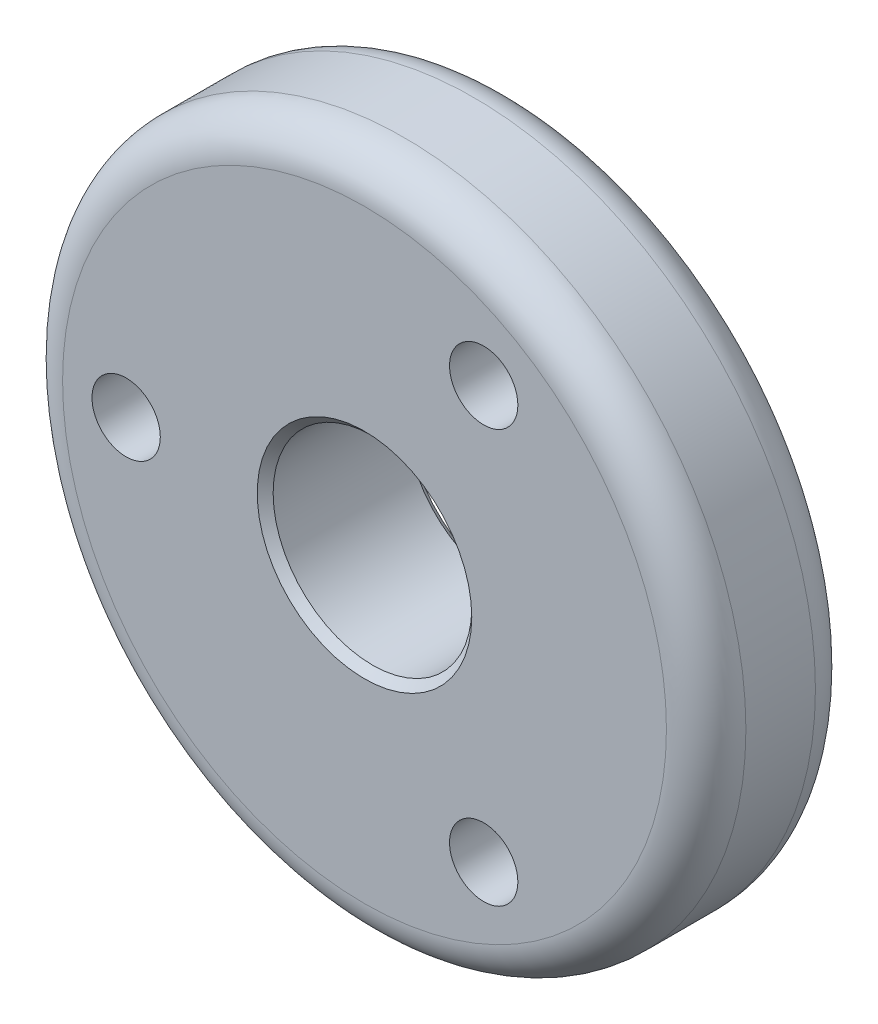
ISO-10303-21;
HEADER;
FILE_DESCRIPTION(('STEP AP214'),'2;1');
FILE_NAME('part.step','',(''),(''),'','','');
FILE_SCHEMA(('AUTOMOTIVE_DESIGN { 1 0 10303 214 1 1 1 1 }'));
ENDSEC;
DATA;
#1=APPLICATION_CONTEXT('core data for automotive mechanical design processes');
#2=APPLICATION_PROTOCOL_DEFINITION('international standard','automotive_design',2000,#1);
#3=PRODUCT_CONTEXT('',#1,'mechanical');
#4=PRODUCT('Part','Part','',(#3));
#5=PRODUCT_RELATED_PRODUCT_CATEGORY('part','',(#4));
#6=PRODUCT_DEFINITION_FORMATION('','',#4);
#7=PRODUCT_DEFINITION_CONTEXT('part definition',#1,'design');
#8=PRODUCT_DEFINITION('design','',#6,#7);
#9=PRODUCT_DEFINITION_SHAPE('','',#8);
#10=(LENGTH_UNIT() NAMED_UNIT(*) SI_UNIT(.MILLI.,.METRE.));
#11=(NAMED_UNIT(*) PLANE_ANGLE_UNIT() SI_UNIT($,.RADIAN.));
#12=(NAMED_UNIT(*) SI_UNIT($,.STERADIAN.) SOLID_ANGLE_UNIT());
#13=UNCERTAINTY_MEASURE_WITH_UNIT(LENGTH_MEASURE(1.E-05),#10,'distance_accuracy_value','');
#14=(GEOMETRIC_REPRESENTATION_CONTEXT(3) GLOBAL_UNCERTAINTY_ASSIGNED_CONTEXT((#13)) GLOBAL_UNIT_ASSIGNED_CONTEXT((#10,
#11,#12)) REPRESENTATION_CONTEXT('',''));
#15=CARTESIAN_POINT('',(0.,0.,0.));
#16=DIRECTION('',(0.,0.,1.));
#17=DIRECTION('',(1.,0.,0.));
#18=AXIS2_PLACEMENT_3D('',#15,#16,#17);
#19=CARTESIAN_POINT('',(0.,0.,1.190625));
#20=DIRECTION('',(0.,0.,1.));
#21=DIRECTION('',(1.,0.,0.));
#22=AXIS2_PLACEMENT_3D('',#19,#20,#21);
#23=PLANE('',#22);
#24=CARTESIAN_POINT('',(1.90500000000002,3.2995567884187,1.190625));
#25=DIRECTION('',(0.,0.,1.));
#26=DIRECTION('',(-0.500000000000004,-0.866025403784436,0.));
#27=AXIS2_PLACEMENT_3D('',#24,#25,#26);
#28=CIRCLE('',#27,0.546100000000001);
#29=CARTESIAN_POINT('',(1.63195000000001,2.82662031541202,1.190625));
#30=VERTEX_POINT('',#29);
#31=EDGE_CURVE('E73',#30,#30,#28,.T.);
#32=ORIENTED_EDGE('',*,*,#31,.F.);
#33=EDGE_LOOP('',(#32));
#34=FACE_BOUND('',#33,.T.);
#35=CARTESIAN_POINT('',(1.90499999999997,-3.29955678841873,1.190625));
#36=DIRECTION('',(0.,0.,1.));
#37=DIRECTION('',(-0.499999999999992,0.866025403784443,0.));
#38=AXIS2_PLACEMENT_3D('',#35,#36,#37);
#39=CIRCLE('',#38,0.546100000000001);
#40=CARTESIAN_POINT('',(1.63194999999997,-2.82662031541204,1.190625));
#41=VERTEX_POINT('',#40);
#42=EDGE_CURVE('E76',#41,#41,#39,.T.);
#43=ORIENTED_EDGE('',*,*,#42,.F.);
#44=EDGE_LOOP('',(#43));
#45=FACE_BOUND('',#44,.T.);
#46=CARTESIAN_POINT('',(-3.81,0.,1.190625));
#47=DIRECTION('',(0.,0.,1.));
#48=DIRECTION('',(1.,0.,0.));
#49=AXIS2_PLACEMENT_3D('',#46,#47,#48);
#50=CIRCLE('',#49,0.546100000000001);
#51=CARTESIAN_POINT('',(-3.2639,0.,1.190625));
#52=VERTEX_POINT('',#51);
#53=EDGE_CURVE('E70',#52,#52,#50,.T.);
#54=ORIENTED_EDGE('',*,*,#53,.F.);
#55=EDGE_LOOP('',(#54));
#56=FACE_BOUND('',#55,.T.);
#57=CARTESIAN_POINT('',(0.,0.,1.190625));
#58=DIRECTION('',(0.,0.,1.));
#59=DIRECTION('',(1.,0.,0.));
#60=AXIS2_PLACEMENT_3D('',#57,#58,#59);
#61=CIRCLE('',#60,1.71450000000001);
#62=CARTESIAN_POINT('',(1.71450000000001,0.,1.190625));
#63=VERTEX_POINT('',#62);
#64=EDGE_CURVE('E10',#63,#63,#61,.F.);
#65=ORIENTED_EDGE('',*,*,#64,.T.);
#66=EDGE_LOOP('',(#65));
#67=FACE_BOUND('',#66,.T.);
#68=CARTESIAN_POINT('',(0.,0.,1.190625));
#69=DIRECTION('',(0.,0.,1.));
#70=DIRECTION('',(1.,0.,0.));
#71=AXIS2_PLACEMENT_3D('',#68,#69,#70);
#72=CIRCLE('',#71,4.826);
#73=CARTESIAN_POINT('',(4.826,0.,1.190625));
#74=VERTEX_POINT('',#73);
#75=EDGE_CURVE('E57',#74,#74,#72,.T.);
#76=ORIENTED_EDGE('',*,*,#75,.T.);
#77=EDGE_LOOP('',(#76));
#78=FACE_BOUND('',#77,.T.);
#79=ADVANCED_FACE('F36',(#34,#45,#56,#67,#78),#23,.T.);
#80=CARTESIAN_POINT('',(0.,0.,-1.190625));
#81=DIRECTION('',(0.,0.,1.));
#82=DIRECTION('',(1.,0.,0.));
#83=AXIS2_PLACEMENT_3D('',#80,#81,#82);
#84=PLANE('',#83);
#85=CARTESIAN_POINT('',(1.90500000000002,3.2995567884187,-1.190625));
#86=DIRECTION('',(0.,0.,1.));
#87=DIRECTION('',(-0.500000000000004,-0.866025403784436,0.));
#88=AXIS2_PLACEMENT_3D('',#85,#86,#87);
#89=CIRCLE('',#88,0.546100000000001);
#90=CARTESIAN_POINT('',(1.63195000000001,2.82662031541202,-1.190625));
#91=VERTEX_POINT('',#90);
#92=EDGE_CURVE('E79',#91,#91,#89,.T.);
#93=ORIENTED_EDGE('',*,*,#92,.T.);
#94=EDGE_LOOP('',(#93));
#95=FACE_BOUND('',#94,.T.);
#96=CARTESIAN_POINT('',(1.90499999999997,-3.29955678841873,-1.190625));
#97=DIRECTION('',(0.,0.,1.));
#98=DIRECTION('',(-0.499999999999992,0.866025403784443,0.));
#99=AXIS2_PLACEMENT_3D('',#96,#97,#98);
#100=CIRCLE('',#99,0.546100000000001);
#101=CARTESIAN_POINT('',(1.63194999999997,-2.82662031541204,-1.190625));
#102=VERTEX_POINT('',#101);
#103=EDGE_CURVE('E80',#102,#102,#100,.T.);
#104=ORIENTED_EDGE('',*,*,#103,.T.);
#105=EDGE_LOOP('',(#104));
#106=FACE_BOUND('',#105,.T.);
#107=CARTESIAN_POINT('',(-3.81,0.,-1.190625));
#108=DIRECTION('',(0.,0.,1.));
#109=DIRECTION('',(1.,0.,0.));
#110=AXIS2_PLACEMENT_3D('',#107,#108,#109);
#111=CIRCLE('',#110,0.546100000000001);
#112=CARTESIAN_POINT('',(-3.2639,0.,-1.190625));
#113=VERTEX_POINT('',#112);
#114=EDGE_CURVE('E69',#113,#113,#111,.T.);
#115=ORIENTED_EDGE('',*,*,#114,.T.);
#116=EDGE_LOOP('',(#115));
#117=FACE_BOUND('',#116,.T.);
#118=CARTESIAN_POINT('',(0.,0.,-1.190625));
#119=DIRECTION('',(0.,0.,1.));
#120=DIRECTION('',(1.,0.,0.));
#121=AXIS2_PLACEMENT_3D('',#118,#119,#120);
#122=CIRCLE('',#121,1.71449999999999);
#123=CARTESIAN_POINT('',(1.71449999999999,0.,-1.190625));
#124=VERTEX_POINT('',#123);
#125=EDGE_CURVE('E52',#124,#124,#122,.T.);
#126=ORIENTED_EDGE('',*,*,#125,.T.);
#127=EDGE_LOOP('',(#126));
#128=FACE_BOUND('',#127,.T.);
#129=CARTESIAN_POINT('',(0.,0.,-1.190625));
#130=DIRECTION('',(0.,0.,1.));
#131=DIRECTION('',(1.,0.,0.));
#132=AXIS2_PLACEMENT_3D('',#129,#130,#131);
#133=CIRCLE('',#132,4.826);
#134=CARTESIAN_POINT('',(4.826,0.,-1.190625));
#135=VERTEX_POINT('',#134);
#136=EDGE_CURVE('E60',#135,#135,#133,.F.);
#137=ORIENTED_EDGE('',*,*,#136,.T.);
#138=EDGE_LOOP('',(#137));
#139=FACE_BOUND('',#138,.T.);
#140=ADVANCED_FACE('F88',(#95,#106,#117,#128,#139),#84,.F.);
#141=CARTESIAN_POINT('',(0.,0.,1.190625));
#142=DIRECTION('',(0.,0.,-1.));
#143=DIRECTION('',(-1.,0.,0.));
#144=AXIS2_PLACEMENT_3D('',#141,#142,#143);
#145=CYLINDRICAL_SURFACE('',#144,5.461);
#146=CARTESIAN_POINT('',(0.,0.,-0.555625));
#147=DIRECTION('',(0.,0.,1.));
#148=DIRECTION('',(1.,0.,0.));
#149=AXIS2_PLACEMENT_3D('',#146,#147,#148);
#150=CIRCLE('',#149,5.461);
#151=CARTESIAN_POINT('',(-5.461,0.,-0.555625));
#152=VERTEX_POINT('',#151);
#153=EDGE_CURVE('E63',#152,#152,#150,.T.);
#154=CARTESIAN_POINT('',(0.,0.,0.555625));
#155=DIRECTION('',(0.,0.,1.));
#156=DIRECTION('',(1.,0.,0.));
#157=AXIS2_PLACEMENT_3D('',#154,#155,#156);
#158=CIRCLE('',#157,5.461);
#159=CARTESIAN_POINT('',(-5.461,0.,0.555625));
#160=VERTEX_POINT('',#159);
#161=EDGE_CURVE('E66',#160,#160,#158,.F.);
#162=CARTESIAN_POINT('',(-5.461,0.,-0.555625));
#163=CARTESIAN_POINT('',(-5.461,0.,-0.544049479166667));
#164=CARTESIAN_POINT('',(-5.461,0.,-0.532473958333333));
#165=CARTESIAN_POINT('',(-5.461,0.,-0.509322916666667));
#166=CARTESIAN_POINT('',(-5.461,0.,-0.497747395833333));
#167=CARTESIAN_POINT('',(-5.461,0.,-0.474596354166667));
#168=CARTESIAN_POINT('',(-5.461,0.,-0.463020833333333));
#169=CARTESIAN_POINT('',(-5.461,0.,-0.439869791666667));
#170=CARTESIAN_POINT('',(-5.461,0.,-0.428294270833333));
#171=CARTESIAN_POINT('',(-5.461,0.,-0.405143229166667));
#172=CARTESIAN_POINT('',(-5.461,0.,-0.393567708333333));
#173=CARTESIAN_POINT('',(-5.461,0.,-0.370416666666667));
#174=CARTESIAN_POINT('',(-5.461,0.,-0.358841145833333));
#175=CARTESIAN_POINT('',(-5.461,0.,-0.335690104166667));
#176=CARTESIAN_POINT('',(-5.461,0.,-0.324114583333333));
#177=CARTESIAN_POINT('',(-5.461,0.,-0.300963541666667));
#178=CARTESIAN_POINT('',(-5.461,0.,-0.289388020833333));
#179=CARTESIAN_POINT('',(-5.461,0.,-0.266236979166667));
#180=CARTESIAN_POINT('',(-5.461,0.,-0.254661458333333));
#181=CARTESIAN_POINT('',(-5.461,0.,-0.231510416666667));
#182=CARTESIAN_POINT('',(-5.461,0.,-0.219934895833333));
#183=CARTESIAN_POINT('',(-5.461,0.,-0.196783854166667));
#184=CARTESIAN_POINT('',(-5.461,0.,-0.185208333333333));
#185=CARTESIAN_POINT('',(-5.461,0.,-0.162057291666667));
#186=CARTESIAN_POINT('',(-5.461,0.,-0.150481770833333));
#187=CARTESIAN_POINT('',(-5.461,0.,-0.127330729166667));
#188=CARTESIAN_POINT('',(-5.461,0.,-0.115755208333333));
#189=CARTESIAN_POINT('',(-5.461,0.,-0.0926041666666666));
#190=CARTESIAN_POINT('',(-5.461,0.,-0.0810286458333333));
#191=CARTESIAN_POINT('',(-5.461,0.,-0.0578776041666667));
#192=CARTESIAN_POINT('',(-5.461,0.,-0.0463020833333334));
#193=CARTESIAN_POINT('',(-5.461,0.,-0.0231510416666667));
#194=CARTESIAN_POINT('',(-5.461,0.,-0.0115755208333333));
#195=CARTESIAN_POINT('',(-5.461,0.,0.0115755208333333));
#196=CARTESIAN_POINT('',(-5.461,0.,0.0231510416666667));
#197=CARTESIAN_POINT('',(-5.461,0.,0.0463020833333334));
#198=CARTESIAN_POINT('',(-5.461,0.,0.0578776041666667));
#199=CARTESIAN_POINT('',(-5.461,0.,0.0810286458333333));
#200=CARTESIAN_POINT('',(-5.461,0.,0.0926041666666666));
#201=CARTESIAN_POINT('',(-5.461,0.,0.115755208333333));
#202=CARTESIAN_POINT('',(-5.461,0.,0.127330729166667));
#203=CARTESIAN_POINT('',(-5.461,0.,0.150481770833333));
#204=CARTESIAN_POINT('',(-5.461,0.,0.162057291666667));
#205=CARTESIAN_POINT('',(-5.461,0.,0.185208333333333));
#206=CARTESIAN_POINT('',(-5.461,0.,0.196783854166667));
#207=CARTESIAN_POINT('',(-5.461,0.,0.219934895833333));
#208=CARTESIAN_POINT('',(-5.461,0.,0.231510416666667));
#209=CARTESIAN_POINT('',(-5.461,0.,0.254661458333333));
#210=CARTESIAN_POINT('',(-5.461,0.,0.266236979166667));
#211=CARTESIAN_POINT('',(-5.461,0.,0.289388020833333));
#212=CARTESIAN_POINT('',(-5.461,0.,0.300963541666667));
#213=CARTESIAN_POINT('',(-5.461,0.,0.324114583333333));
#214=CARTESIAN_POINT('',(-5.461,0.,0.335690104166667));
#215=CARTESIAN_POINT('',(-5.461,0.,0.358841145833333));
#216=CARTESIAN_POINT('',(-5.461,0.,0.370416666666667));
#217=CARTESIAN_POINT('',(-5.461,0.,0.393567708333333));
#218=CARTESIAN_POINT('',(-5.461,0.,0.405143229166667));
#219=CARTESIAN_POINT('',(-5.461,0.,0.428294270833333));
#220=CARTESIAN_POINT('',(-5.461,0.,0.439869791666667));
#221=CARTESIAN_POINT('',(-5.461,0.,0.463020833333333));
#222=CARTESIAN_POINT('',(-5.461,0.,0.474596354166667));
#223=CARTESIAN_POINT('',(-5.461,0.,0.497747395833333));
#224=CARTESIAN_POINT('',(-5.461,0.,0.509322916666667));
#225=CARTESIAN_POINT('',(-5.461,0.,0.532473958333333));
#226=CARTESIAN_POINT('',(-5.461,0.,0.544049479166667));
#227=CARTESIAN_POINT('',(-5.461,0.,0.555625));
#228=B_SPLINE_CURVE_WITH_KNOTS('',3,(#162,#163,#164,#165,#166,#167,#168,#169,#170,#171,#172,
#173,#174,#175,#176,#177,#178,#179,#180,#181,#182,#183,#184,#185,#186,#187,#188,#189,#190,#191,
#192,#193,#194,#195,#196,#197,#198,#199,#200,#201,#202,#203,#204,#205,#206,#207,#208,#209,#210,
#211,#212,#213,#214,#215,#216,#217,#218,#219,#220,#221,#222,#223,#224,#225,#226,#227),
.UNSPECIFIED.,.F.,.F.,(4,2,2,2,2,2,2,2,2,2,2,2,2,2,2,2,2,2,2,2,2,2,2,2,2,2,2,2,2,2,2,2,4),(0.,
0.0347265625,0.0694531250000001,0.1041796875,0.13890625,0.1736328125,0.208359375,0.2430859375,
0.2778125,0.3125390625,0.347265625,0.3819921875,0.41671875,0.4514453125,0.486171875,
0.5208984375,0.555625,0.5903515625,0.625078125,0.6598046875,0.69453125,0.7292578125,0.763984375,
0.7987109375,0.8334375,0.8681640625,0.902890625,0.9376171875,0.97234375,1.0070703125,
1.041796875,1.0765234375,1.11125),.UNSPECIFIED.);
#229=EDGE_CURVE('BSEAM128',#152,#160,#228,.T.);
#230=ORIENTED_EDGE('',*,*,#153,.T.);
#231=ORIENTED_EDGE('',*,*,#161,.T.);
#232=ORIENTED_EDGE('',*,*,#229,.T.);
#233=ORIENTED_EDGE('',*,*,#229,.F.);
#234=EDGE_LOOP('',(#230,#232,#231,#233));
#235=FACE_BOUND('',#234,.T.);
#236=ADVANCED_FACE('F128',(#235),#145,.T.);
#237=CARTESIAN_POINT('',(0.,0.,1.190625));
#238=DIRECTION('',(0.,0.,-1.));
#239=DIRECTION('',(-1.,0.,0.));
#240=AXIS2_PLACEMENT_3D('',#237,#238,#239);
#241=CYLINDRICAL_SURFACE('',#240,1.5875);
#242=CARTESIAN_POINT('',(0.,0.,-1.06362500000001));
#243=DIRECTION('',(0.,0.,1.));
#244=DIRECTION('',(1.,0.,0.));
#245=AXIS2_PLACEMENT_3D('',#242,#243,#244);
#246=CIRCLE('',#245,1.5875);
#247=CARTESIAN_POINT('',(-1.5875,0.,-1.06362500000001));
#248=VERTEX_POINT('',#247);
#249=EDGE_CURVE('E44',#248,#248,#246,.F.);
#250=CARTESIAN_POINT('',(0.,0.,1.06362499999999));
#251=DIRECTION('',(0.,0.,1.));
#252=DIRECTION('',(1.,0.,0.));
#253=AXIS2_PLACEMENT_3D('',#250,#251,#252);
#254=CIRCLE('',#253,1.5875);
#255=CARTESIAN_POINT('',(-1.5875,0.,1.06362499999999));
#256=VERTEX_POINT('',#255);
#257=EDGE_CURVE('E48',#256,#256,#254,.T.);
#258=CARTESIAN_POINT('',(-1.5875,0.,-1.06362500000001));
#259=CARTESIAN_POINT('',(-1.5875,0.,-1.04146614583334));
#260=CARTESIAN_POINT('',(-1.5875,0.,-1.01930729166667));
#261=CARTESIAN_POINT('',(-1.5875,0.,-0.97498958333334));
#262=CARTESIAN_POINT('',(-1.5875,0.,-0.952830729166673));
#263=CARTESIAN_POINT('',(-1.5875,0.,-0.90851302083334));
#264=CARTESIAN_POINT('',(-1.5875,0.,-0.886354166666674));
#265=CARTESIAN_POINT('',(-1.5875,0.,-0.842036458333341));
#266=CARTESIAN_POINT('',(-1.5875,0.,-0.819877604166674));
#267=CARTESIAN_POINT('',(-1.5875,0.,-0.775559895833341));
#268=CARTESIAN_POINT('',(-1.5875,0.,-0.753401041666674));
#269=CARTESIAN_POINT('',(-1.5875,0.,-0.709083333333341));
#270=CARTESIAN_POINT('',(-1.5875,0.,-0.686924479166674));
#271=CARTESIAN_POINT('',(-1.5875,0.,-0.642606770833341));
#272=CARTESIAN_POINT('',(-1.5875,0.,-0.620447916666675));
#273=CARTESIAN_POINT('',(-1.5875,0.,-0.576130208333342));
#274=CARTESIAN_POINT('',(-1.5875,0.,-0.553971354166675));
#275=CARTESIAN_POINT('',(-1.5875,0.,-0.509653645833342));
#276=CARTESIAN_POINT('',(-1.5875,0.,-0.487494791666675));
#277=CARTESIAN_POINT('',(-1.5875,0.,-0.443177083333342));
#278=CARTESIAN_POINT('',(-1.5875,0.,-0.421018229166675));
#279=CARTESIAN_POINT('',(-1.5875,0.,-0.376700520833342));
#280=CARTESIAN_POINT('',(-1.5875,0.,-0.354541666666675));
#281=CARTESIAN_POINT('',(-1.5875,0.,-0.310223958333342));
#282=CARTESIAN_POINT('',(-1.5875,0.,-0.288065104166676));
#283=CARTESIAN_POINT('',(-1.5875,0.,-0.243747395833342));
#284=CARTESIAN_POINT('',(-1.5875,0.,-0.221588541666676));
#285=CARTESIAN_POINT('',(-1.5875,0.,-0.177270833333343));
#286=CARTESIAN_POINT('',(-1.5875,0.,-0.155111979166676));
#287=CARTESIAN_POINT('',(-1.5875,0.,-0.110794270833343));
#288=CARTESIAN_POINT('',(-1.5875,0.,-0.0886354166666762));
#289=CARTESIAN_POINT('',(-1.5875,0.,-0.044317708333343));
#290=CARTESIAN_POINT('',(-1.5875,0.,-0.0221588541666764));
#291=CARTESIAN_POINT('',(-1.5875,0.,0.0221588541666569));
#292=CARTESIAN_POINT('',(-1.5875,0.,0.0443177083333235));
#293=CARTESIAN_POINT('',(-1.5875,0.,0.0886354166666567));
#294=CARTESIAN_POINT('',(-1.5875,0.,0.110794270833323));
#295=CARTESIAN_POINT('',(-1.5875,0.,0.155111979166656));
#296=CARTESIAN_POINT('',(-1.5875,0.,0.177270833333323));
#297=CARTESIAN_POINT('',(-1.5875,0.,0.221588541666656));
#298=CARTESIAN_POINT('',(-1.5875,0.,0.243747395833323));
#299=CARTESIAN_POINT('',(-1.5875,0.,0.288065104166656));
#300=CARTESIAN_POINT('',(-1.5875,0.,0.310223958333323));
#301=CARTESIAN_POINT('',(-1.5875,0.,0.354541666666656));
#302=CARTESIAN_POINT('',(-1.5875,0.,0.376700520833322));
#303=CARTESIAN_POINT('',(-1.5875,0.,0.421018229166656));
#304=CARTESIAN_POINT('',(-1.5875,0.,0.443177083333322));
#305=CARTESIAN_POINT('',(-1.5875,0.,0.487494791666655));
#306=CARTESIAN_POINT('',(-1.5875,0.,0.509653645833322));
#307=CARTESIAN_POINT('',(-1.5875,0.,0.553971354166655));
#308=CARTESIAN_POINT('',(-1.5875,0.,0.576130208333322));
#309=CARTESIAN_POINT('',(-1.5875,0.,0.620447916666655));
#310=CARTESIAN_POINT('',(-1.5875,0.,0.642606770833322));
#311=CARTESIAN_POINT('',(-1.5875,0.,0.686924479166655));
#312=CARTESIAN_POINT('',(-1.5875,0.,0.709083333333321));
#313=CARTESIAN_POINT('',(-1.5875,0.,0.753401041666655));
#314=CARTESIAN_POINT('',(-1.5875,0.,0.775559895833321));
#315=CARTESIAN_POINT('',(-1.5875,0.,0.819877604166654));
#316=CARTESIAN_POINT('',(-1.5875,0.,0.842036458333321));
#317=CARTESIAN_POINT('',(-1.5875,0.,0.886354166666654));
#318=CARTESIAN_POINT('',(-1.5875,0.,0.908513020833321));
#319=CARTESIAN_POINT('',(-1.5875,0.,0.952830729166654));
#320=CARTESIAN_POINT('',(-1.5875,0.,0.974989583333321));
#321=CARTESIAN_POINT('',(-1.5875,0.,1.01930729166665));
#322=CARTESIAN_POINT('',(-1.5875,0.,1.04146614583332));
#323=CARTESIAN_POINT('',(-1.5875,0.,1.06362499999999));
#324=B_SPLINE_CURVE_WITH_KNOTS('',3,(#258,#259,#260,#261,#262,#263,#264,#265,#266,#267,#268,
#269,#270,#271,#272,#273,#274,#275,#276,#277,#278,#279,#280,#281,#282,#283,#284,#285,#286,#287,
#288,#289,#290,#291,#292,#293,#294,#295,#296,#297,#298,#299,#300,#301,#302,#303,#304,#305,#306,
#307,#308,#309,#310,#311,#312,#313,#314,#315,#316,#317,#318,#319,#320,#321,#322,#323),
.UNSPECIFIED.,.F.,.F.,(4,2,2,2,2,2,2,2,2,2,2,2,2,2,2,2,2,2,2,2,2,2,2,2,2,2,2,2,2,2,2,2,4),(0.,
0.0664765624999999,0.132953125,0.199429687499999,0.265906249999999,0.332382812499999,
0.398859374999999,0.465335937499999,0.531812499999998,0.598289062499998,0.664765624999998,
0.731242187499998,0.797718749999998,0.864195312499997,0.930671874999997,0.997148437499997,
1.063625,1.1301015625,1.196578125,1.2630546875,1.32953125,1.3960078125,1.462484375,1.5289609375,
1.5954375,1.6619140625,1.728390625,1.79486718749999,1.86134374999999,1.92782031249999,
1.99429687499999,2.06077343749999,2.12724999999999),.UNSPECIFIED.);
#325=EDGE_CURVE('BSEAM118',#248,#256,#324,.T.);
#326=ORIENTED_EDGE('',*,*,#249,.T.);
#327=ORIENTED_EDGE('',*,*,#257,.T.);
#328=ORIENTED_EDGE('',*,*,#325,.T.);
#329=ORIENTED_EDGE('',*,*,#325,.F.);
#330=EDGE_LOOP('',(#326,#328,#327,#329));
#331=FACE_BOUND('',#330,.T.);
#332=ADVANCED_FACE('F118',(#331),#241,.F.);
#333=CARTESIAN_POINT('',(0.,0.,-0.555625));
#334=DIRECTION('',(0.,0.,1.));
#335=DIRECTION('',(1.,0.,0.));
#336=AXIS2_PLACEMENT_3D('',#333,#334,#335);
#337=TOROIDAL_SURFACE('',#336,4.826,0.635);
#338=ORIENTED_EDGE('',*,*,#136,.F.);
#339=EDGE_LOOP('',(#338));
#340=FACE_BOUND('',#339,.T.);
#341=ORIENTED_EDGE('',*,*,#153,.F.);
#342=EDGE_LOOP('',(#341));
#343=FACE_BOUND('',#342,.T.);
#344=ADVANCED_FACE('F110',(#340,#343),#337,.T.);
#345=CARTESIAN_POINT('',(0.,0.,0.555625));
#346=DIRECTION('',(0.,0.,1.));
#347=DIRECTION('',(1.,0.,0.));
#348=AXIS2_PLACEMENT_3D('',#345,#346,#347);
#349=TOROIDAL_SURFACE('',#348,4.826,0.635);
#350=ORIENTED_EDGE('',*,*,#161,.F.);
#351=EDGE_LOOP('',(#350));
#352=FACE_BOUND('',#351,.T.);
#353=ORIENTED_EDGE('',*,*,#75,.F.);
#354=EDGE_LOOP('',(#353));
#355=FACE_BOUND('',#354,.T.);
#356=ADVANCED_FACE('F107',(#352,#355),#349,.T.);
#357=CARTESIAN_POINT('',(0.,0.,-1.190625));
#358=DIRECTION('',(0.,0.,-1.));
#359=DIRECTION('',(-1.,0.,0.));
#360=AXIS2_PLACEMENT_3D('',#357,#358,#359);
#361=CONICAL_SURFACE('',#360,1.71449999999999,0.785398163397447);
#362=ORIENTED_EDGE('',*,*,#249,.F.);
#363=EDGE_LOOP('',(#362));
#364=FACE_BOUND('',#363,.T.);
#365=ORIENTED_EDGE('',*,*,#125,.F.);
#366=EDGE_LOOP('',(#365));
#367=FACE_BOUND('',#366,.T.);
#368=ADVANCED_FACE('F109',(#364,#367),#361,.F.);
#369=CARTESIAN_POINT('',(0.,0.,1.06362499999999));
#370=DIRECTION('',(0.,0.,1.));
#371=DIRECTION('',(1.,0.,0.));
#372=AXIS2_PLACEMENT_3D('',#369,#370,#371);
#373=CONICAL_SURFACE('',#372,1.5875,0.785398163397448);
#374=ORIENTED_EDGE('',*,*,#64,.F.);
#375=EDGE_LOOP('',(#374));
#376=FACE_BOUND('',#375,.T.);
#377=ORIENTED_EDGE('',*,*,#257,.F.);
#378=EDGE_LOOP('',(#377));
#379=FACE_BOUND('',#378,.T.);
#380=ADVANCED_FACE('F39',(#376,#379),#373,.F.);
#381=CARTESIAN_POINT('',(-3.81,0.,-1.190625));
#382=DIRECTION('',(0.,0.,1.));
#383=DIRECTION('',(1.,0.,0.));
#384=AXIS2_PLACEMENT_3D('',#381,#382,#383);
#385=CYLINDRICAL_SURFACE('',#384,0.546100000000001);
#386=ORIENTED_EDGE('',*,*,#114,.F.);
#387=EDGE_LOOP('',(#386));
#388=FACE_BOUND('',#387,.T.);
#389=ORIENTED_EDGE('',*,*,#53,.T.);
#390=EDGE_LOOP('',(#389));
#391=FACE_BOUND('',#390,.T.);
#392=ADVANCED_FACE('F136',(#388,#391),#385,.F.);
#393=CARTESIAN_POINT('',(1.90499999999997,-3.29955678841873,-1.190625));
#394=DIRECTION('',(0.,0.,1.));
#395=DIRECTION('',(-0.499999999999992,0.866025403784443,0.));
#396=AXIS2_PLACEMENT_3D('',#393,#394,#395);
#397=CYLINDRICAL_SURFACE('',#396,0.546100000000001);
#398=ORIENTED_EDGE('',*,*,#103,.F.);
#399=EDGE_LOOP('',(#398));
#400=FACE_BOUND('',#399,.T.);
#401=ORIENTED_EDGE('',*,*,#42,.T.);
#402=EDGE_LOOP('',(#401));
#403=FACE_BOUND('',#402,.T.);
#404=ADVANCED_FACE('F94',(#400,#403),#397,.F.);
#405=CARTESIAN_POINT('',(1.90500000000002,3.2995567884187,-1.190625));
#406=DIRECTION('',(0.,0.,1.));
#407=DIRECTION('',(-0.500000000000004,-0.866025403784436,0.));
#408=AXIS2_PLACEMENT_3D('',#405,#406,#407);
#409=CYLINDRICAL_SURFACE('',#408,0.546100000000001);
#410=ORIENTED_EDGE('',*,*,#92,.F.);
#411=EDGE_LOOP('',(#410));
#412=FACE_BOUND('',#411,.T.);
#413=ORIENTED_EDGE('',*,*,#31,.T.);
#414=EDGE_LOOP('',(#413));
#415=FACE_BOUND('',#414,.T.);
#416=ADVANCED_FACE('F91',(#412,#415),#409,.F.);
#417=CLOSED_SHELL('',(#79,#140,#236,#332,#344,#356,#368,#380,#392,#404,#416));
#418=MANIFOLD_SOLID_BREP('B2',#417);
#419=ADVANCED_BREP_SHAPE_REPRESENTATION('',(#18,#418),#14);
#420=SHAPE_DEFINITION_REPRESENTATION(#9,#419);
ENDSEC;
END-ISO-10303-21;
